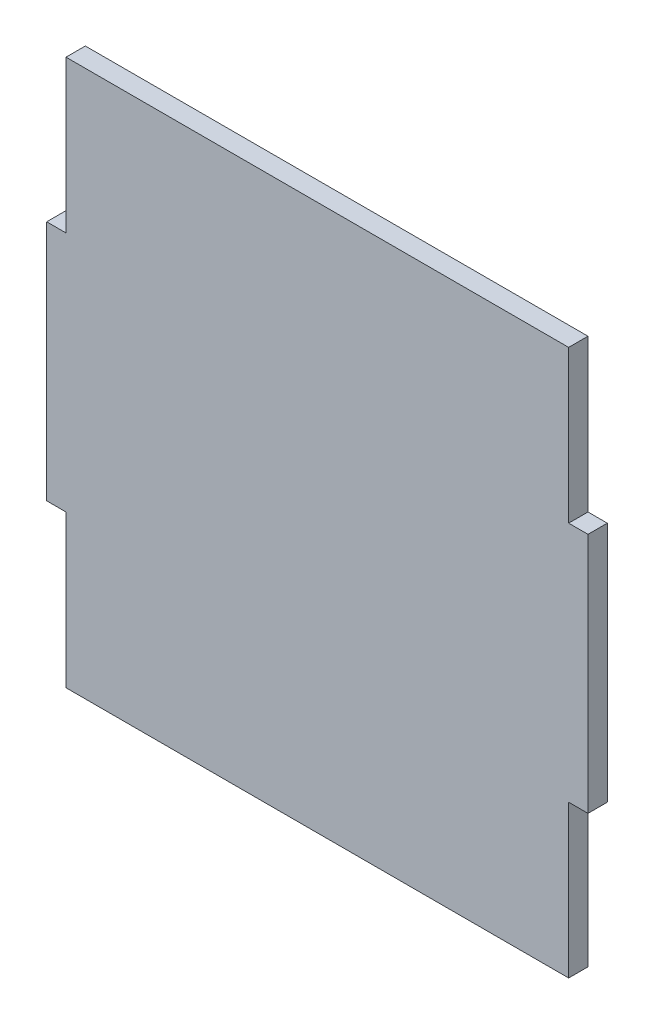
ISO-10303-21;
HEADER;
FILE_DESCRIPTION(('STEP AP214'),'2;1');
FILE_NAME('part.step','',(''),(''),'','','');
FILE_SCHEMA(('AUTOMOTIVE_DESIGN { 1 0 10303 214 1 1 1 1 }'));
ENDSEC;
DATA;
#1=APPLICATION_CONTEXT('core data for automotive mechanical design processes');
#2=APPLICATION_PROTOCOL_DEFINITION('international standard','automotive_design',2000,#1);
#3=PRODUCT_CONTEXT('',#1,'mechanical');
#4=PRODUCT('Part','Part','',(#3));
#5=PRODUCT_RELATED_PRODUCT_CATEGORY('part','',(#4));
#6=PRODUCT_DEFINITION_FORMATION('','',#4);
#7=PRODUCT_DEFINITION_CONTEXT('part definition',#1,'design');
#8=PRODUCT_DEFINITION('design','',#6,#7);
#9=PRODUCT_DEFINITION_SHAPE('','',#8);
#10=(LENGTH_UNIT() NAMED_UNIT(*) SI_UNIT(.MILLI.,.METRE.));
#11=(NAMED_UNIT(*) PLANE_ANGLE_UNIT() SI_UNIT($,.RADIAN.));
#12=(NAMED_UNIT(*) SI_UNIT($,.STERADIAN.) SOLID_ANGLE_UNIT());
#13=UNCERTAINTY_MEASURE_WITH_UNIT(LENGTH_MEASURE(1.E-05),#10,'distance_accuracy_value','');
#14=(GEOMETRIC_REPRESENTATION_CONTEXT(3) GLOBAL_UNCERTAINTY_ASSIGNED_CONTEXT((#13)) GLOBAL_UNIT_ASSIGNED_CONTEXT((#10,
#11,#12)) REPRESENTATION_CONTEXT('',''));
#15=CARTESIAN_POINT('',(0.,0.,0.));
#16=DIRECTION('',(0.,0.,1.));
#17=DIRECTION('',(1.,0.,0.));
#18=AXIS2_PLACEMENT_3D('',#15,#16,#17);
#19=CARTESIAN_POINT('',(-3.99999999999943,-80.,44.));
#20=DIRECTION('',(-1.,0.,0.));
#21=DIRECTION('',(0.,0.,1.));
#22=AXIS2_PLACEMENT_3D('',#19,#20,#21);
#23=PLANE('',#22);
#24=DIRECTION('',(0.,0.,-1.));
#25=VECTOR('',#24,1.);
#26=CARTESIAN_POINT('',(-3.99999999999943,-27.9999999999998,40.));
#27=LINE('',#26,#25);
#28=CARTESIAN_POINT('',(-3.99999999999943,-27.9999999999998,44.));
#29=VERTEX_POINT('',#28);
#30=CARTESIAN_POINT('',(-3.99999999999943,-27.9999999999998,40.));
#31=VERTEX_POINT('',#30);
#32=EDGE_CURVE('E52',#29,#31,#27,.T.);
#33=ORIENTED_EDGE('',*,*,#32,.F.);
#34=DIRECTION('',(0.,1.,0.));
#35=VECTOR('',#34,1.);
#36=CARTESIAN_POINT('',(-3.99999999999943,-80.,44.));
#37=LINE('',#36,#35);
#38=CARTESIAN_POINT('',(-3.99999999999943,-59.4999999999998,44.));
#39=VERTEX_POINT('',#38);
#40=EDGE_CURVE('E206',#39,#29,#37,.T.);
#41=ORIENTED_EDGE('',*,*,#40,.F.);
#42=DIRECTION('',(0.,0.,-1.));
#43=VECTOR('',#42,1.);
#44=CARTESIAN_POINT('',(-3.99999999999943,-59.4999999999998,44.));
#45=LINE('',#44,#43);
#46=CARTESIAN_POINT('',(-3.99999999999943,-59.4999999999998,40.));
#47=VERTEX_POINT('',#46);
#48=EDGE_CURVE('E199',#39,#47,#45,.T.);
#49=ORIENTED_EDGE('',*,*,#48,.T.);
#50=DIRECTION('',(0.,1.,0.));
#51=VECTOR('',#50,1.);
#52=CARTESIAN_POINT('',(-3.99999999999943,-80.,40.));
#53=LINE('',#52,#51);
#54=EDGE_CURVE('E208',#47,#31,#53,.T.);
#55=ORIENTED_EDGE('',*,*,#54,.T.);
#56=EDGE_LOOP('',(#33,#41,#49,#55));
#57=FACE_BOUND('',#56,.T.);
#58=ADVANCED_FACE('F36',(#57),#23,.F.);
#59=DIRECTION('',(0.,0.,1.));
#60=VECTOR('',#59,1.);
#61=CARTESIAN_POINT('',(-3.99999999999943,22.0000000000002,40.));
#62=LINE('',#61,#60);
#63=CARTESIAN_POINT('',(-3.99999999999943,22.0000000000002,40.));
#64=VERTEX_POINT('',#63);
#65=CARTESIAN_POINT('',(-3.99999999999943,22.0000000000002,44.));
#66=VERTEX_POINT('',#65);
#67=EDGE_CURVE('E60',#64,#66,#62,.T.);
#68=ORIENTED_EDGE('',*,*,#67,.F.);
#69=CARTESIAN_POINT('',(-3.99999999999943,53.5000000000002,40.));
#70=VERTEX_POINT('',#69);
#71=EDGE_CURVE('E150',#64,#70,#53,.T.);
#72=ORIENTED_EDGE('',*,*,#71,.T.);
#73=DIRECTION('',(0.,0.,-1.));
#74=VECTOR('',#73,1.);
#75=CARTESIAN_POINT('',(-3.99999999999943,53.5000000000002,44.));
#76=LINE('',#75,#74);
#77=CARTESIAN_POINT('',(-3.99999999999943,53.5000000000002,44.));
#78=VERTEX_POINT('',#77);
#79=EDGE_CURVE('E187',#78,#70,#76,.T.);
#80=ORIENTED_EDGE('',*,*,#79,.F.);
#81=EDGE_CURVE('E207',#66,#78,#37,.T.);
#82=ORIENTED_EDGE('',*,*,#81,.F.);
#83=EDGE_LOOP('',(#68,#72,#80,#82));
#84=FACE_BOUND('',#83,.T.);
#85=ADVANCED_FACE('F212',(#84),#23,.F.);
#86=CARTESIAN_POINT('',(-108.,-80.,44.));
#87=DIRECTION('',(1.,0.,0.));
#88=DIRECTION('',(0.,0.,-1.));
#89=AXIS2_PLACEMENT_3D('',#86,#87,#88);
#90=PLANE('',#89);
#91=DIRECTION('',(0.,0.,-1.));
#92=VECTOR('',#91,1.);
#93=CARTESIAN_POINT('',(-108.,22.0000000000002,40.));
#94=LINE('',#93,#92);
#95=CARTESIAN_POINT('',(-108.,22.0000000000002,44.));
#96=VERTEX_POINT('',#95);
#97=CARTESIAN_POINT('',(-108.,22.0000000000002,40.));
#98=VERTEX_POINT('',#97);
#99=EDGE_CURVE('E154',#96,#98,#94,.T.);
#100=ORIENTED_EDGE('',*,*,#99,.F.);
#101=DIRECTION('',(0.,-1.,0.));
#102=VECTOR('',#101,1.);
#103=CARTESIAN_POINT('',(-108.,-80.,44.));
#104=LINE('',#103,#102);
#105=CARTESIAN_POINT('',(-108.,53.5000000000002,44.));
#106=VERTEX_POINT('',#105);
#107=EDGE_CURVE('E11',#106,#96,#104,.T.);
#108=ORIENTED_EDGE('',*,*,#107,.F.);
#109=DIRECTION('',(0.,0.,-1.));
#110=VECTOR('',#109,1.);
#111=CARTESIAN_POINT('',(-108.,53.5000000000002,44.));
#112=LINE('',#111,#110);
#113=CARTESIAN_POINT('',(-108.,53.5000000000002,40.));
#114=VERTEX_POINT('',#113);
#115=EDGE_CURVE('E191',#106,#114,#112,.T.);
#116=ORIENTED_EDGE('',*,*,#115,.T.);
#117=DIRECTION('',(0.,-1.,0.));
#118=VECTOR('',#117,1.);
#119=CARTESIAN_POINT('',(-108.,-80.,40.));
#120=LINE('',#119,#118);
#121=EDGE_CURVE('E39',#114,#98,#120,.T.);
#122=ORIENTED_EDGE('',*,*,#121,.T.);
#123=EDGE_LOOP('',(#100,#108,#116,#122));
#124=FACE_BOUND('',#123,.T.);
#125=ADVANCED_FACE('F250',(#124),#90,.F.);
#126=DIRECTION('',(0.,0.,1.));
#127=VECTOR('',#126,1.);
#128=CARTESIAN_POINT('',(-108.,-27.9999999999998,40.));
#129=LINE('',#128,#127);
#130=CARTESIAN_POINT('',(-108.,-27.9999999999998,40.));
#131=VERTEX_POINT('',#130);
#132=CARTESIAN_POINT('',(-108.,-27.9999999999998,44.));
#133=VERTEX_POINT('',#132);
#134=EDGE_CURVE('E151',#131,#133,#129,.T.);
#135=ORIENTED_EDGE('',*,*,#134,.F.);
#136=CARTESIAN_POINT('',(-108.,-59.4999999999998,40.));
#137=VERTEX_POINT('',#136);
#138=EDGE_CURVE('E209',#131,#137,#120,.T.);
#139=ORIENTED_EDGE('',*,*,#138,.T.);
#140=DIRECTION('',(0.,0.,-1.));
#141=VECTOR('',#140,1.);
#142=CARTESIAN_POINT('',(-108.,-59.4999999999998,44.));
#143=LINE('',#142,#141);
#144=CARTESIAN_POINT('',(-108.,-59.4999999999998,44.));
#145=VERTEX_POINT('',#144);
#146=EDGE_CURVE('E190',#145,#137,#143,.T.);
#147=ORIENTED_EDGE('',*,*,#146,.F.);
#148=EDGE_CURVE('E44',#133,#145,#104,.T.);
#149=ORIENTED_EDGE('',*,*,#148,.F.);
#150=EDGE_LOOP('',(#135,#139,#147,#149));
#151=FACE_BOUND('',#150,.T.);
#152=ADVANCED_FACE('F239',(#151),#90,.F.);
#153=CARTESIAN_POINT('',(0.,0.,44.));
#154=DIRECTION('',(0.,0.,1.));
#155=DIRECTION('',(1.,0.,0.));
#156=AXIS2_PLACEMENT_3D('',#153,#154,#155);
#157=PLANE('',#156);
#158=DIRECTION('',(-1.,0.,0.));
#159=VECTOR('',#158,1.);
#160=CARTESIAN_POINT('',(0.,53.5000000000002,44.));
#161=LINE('',#160,#159);
#162=EDGE_CURVE('E184',#78,#106,#161,.T.);
#163=ORIENTED_EDGE('',*,*,#162,.T.);
#164=ORIENTED_EDGE('',*,*,#107,.T.);
#165=DIRECTION('',(1.,0.,0.));
#166=VECTOR('',#165,1.);
#167=CARTESIAN_POINT('',(-112.,22.0000000000002,44.));
#168=LINE('',#167,#166);
#169=CARTESIAN_POINT('',(-112.,22.0000000000002,44.));
#170=VERTEX_POINT('',#169);
#171=EDGE_CURVE('E174',#170,#96,#168,.T.);
#172=ORIENTED_EDGE('',*,*,#171,.F.);
#173=DIRECTION('',(0.,1.,0.));
#174=VECTOR('',#173,1.);
#175=CARTESIAN_POINT('',(-112.,-27.9999999999998,44.));
#176=LINE('',#175,#174);
#177=CARTESIAN_POINT('',(-112.,-27.9999999999998,44.));
#178=VERTEX_POINT('',#177);
#179=EDGE_CURVE('E165',#178,#170,#176,.T.);
#180=ORIENTED_EDGE('',*,*,#179,.F.);
#181=DIRECTION('',(1.,0.,0.));
#182=VECTOR('',#181,1.);
#183=CARTESIAN_POINT('',(-112.,-27.9999999999998,44.));
#184=LINE('',#183,#182);
#185=EDGE_CURVE('E177',#178,#133,#184,.T.);
#186=ORIENTED_EDGE('',*,*,#185,.T.);
#187=ORIENTED_EDGE('',*,*,#148,.T.);
#188=DIRECTION('',(-1.,0.,0.));
#189=VECTOR('',#188,1.);
#190=CARTESIAN_POINT('',(0.,-59.4999999999998,44.));
#191=LINE('',#190,#189);
#192=EDGE_CURVE('E196',#39,#145,#191,.T.);
#193=ORIENTED_EDGE('',*,*,#192,.F.);
#194=ORIENTED_EDGE('',*,*,#40,.T.);
#195=DIRECTION('',(-1.,0.,0.));
#196=VECTOR('',#195,1.);
#197=CARTESIAN_POINT('',(5.72458747072346E-13,-27.9999999999998,44.));
#198=LINE('',#197,#196);
#199=CARTESIAN_POINT('',(5.72458747072346E-13,-27.9999999999998,44.));
#200=VERTEX_POINT('',#199);
#201=EDGE_CURVE('E156',#200,#29,#198,.T.);
#202=ORIENTED_EDGE('',*,*,#201,.F.);
#203=DIRECTION('',(0.,-1.,0.));
#204=VECTOR('',#203,1.);
#205=CARTESIAN_POINT('',(5.72458747072346E-13,22.0000000000002,44.));
#206=LINE('',#205,#204);
#207=CARTESIAN_POINT('',(5.72458747072346E-13,22.0000000000002,44.));
#208=VERTEX_POINT('',#207);
#209=EDGE_CURVE('E136',#208,#200,#206,.T.);
#210=ORIENTED_EDGE('',*,*,#209,.F.);
#211=DIRECTION('',(-1.,0.,0.));
#212=VECTOR('',#211,1.);
#213=CARTESIAN_POINT('',(5.72458747072346E-13,22.0000000000002,44.));
#214=LINE('',#213,#212);
#215=EDGE_CURVE('E133',#208,#66,#214,.T.);
#216=ORIENTED_EDGE('',*,*,#215,.T.);
#217=ORIENTED_EDGE('',*,*,#81,.T.);
#218=EDGE_LOOP('',(#163,#164,#172,#180,#186,#187,#193,#194,#202,#210,#216,#217));
#219=FACE_BOUND('',#218,.T.);
#220=ADVANCED_FACE('F220',(#219),#157,.T.);
#221=CARTESIAN_POINT('',(0.,0.,40.));
#222=DIRECTION('',(0.,0.,1.));
#223=DIRECTION('',(1.,0.,0.));
#224=AXIS2_PLACEMENT_3D('',#221,#222,#223);
#225=PLANE('',#224);
#226=ORIENTED_EDGE('',*,*,#121,.F.);
#227=DIRECTION('',(-1.,0.,0.));
#228=VECTOR('',#227,1.);
#229=CARTESIAN_POINT('',(0.,53.5000000000002,40.));
#230=LINE('',#229,#228);
#231=EDGE_CURVE('E188',#70,#114,#230,.T.);
#232=ORIENTED_EDGE('',*,*,#231,.F.);
#233=ORIENTED_EDGE('',*,*,#71,.F.);
#234=DIRECTION('',(-1.,0.,0.));
#235=VECTOR('',#234,1.);
#236=CARTESIAN_POINT('',(5.72458747072346E-13,22.0000000000002,40.));
#237=LINE('',#236,#235);
#238=CARTESIAN_POINT('',(5.72458747072346E-13,22.0000000000002,40.));
#239=VERTEX_POINT('',#238);
#240=EDGE_CURVE('E131',#239,#64,#237,.T.);
#241=ORIENTED_EDGE('',*,*,#240,.F.);
#242=DIRECTION('',(0.,1.,0.));
#243=VECTOR('',#242,1.);
#244=CARTESIAN_POINT('',(5.72458747072346E-13,22.0000000000002,40.));
#245=LINE('',#244,#243);
#246=CARTESIAN_POINT('',(5.72458747072346E-13,-27.9999999999998,40.));
#247=VERTEX_POINT('',#246);
#248=EDGE_CURVE('E137',#247,#239,#245,.T.);
#249=ORIENTED_EDGE('',*,*,#248,.F.);
#250=DIRECTION('',(-1.,0.,0.));
#251=VECTOR('',#250,1.);
#252=CARTESIAN_POINT('',(5.72458747072346E-13,-27.9999999999998,40.));
#253=LINE('',#252,#251);
#254=EDGE_CURVE('E227',#247,#31,#253,.T.);
#255=ORIENTED_EDGE('',*,*,#254,.T.);
#256=ORIENTED_EDGE('',*,*,#54,.F.);
#257=DIRECTION('',(-1.,0.,0.));
#258=VECTOR('',#257,1.);
#259=CARTESIAN_POINT('',(0.,-59.4999999999998,40.));
#260=LINE('',#259,#258);
#261=EDGE_CURVE('E183',#47,#137,#260,.T.);
#262=ORIENTED_EDGE('',*,*,#261,.T.);
#263=ORIENTED_EDGE('',*,*,#138,.F.);
#264=DIRECTION('',(1.,0.,0.));
#265=VECTOR('',#264,1.);
#266=CARTESIAN_POINT('',(-112.,-27.9999999999998,40.));
#267=LINE('',#266,#265);
#268=CARTESIAN_POINT('',(-112.,-27.9999999999998,40.));
#269=VERTEX_POINT('',#268);
#270=EDGE_CURVE('E180',#269,#131,#267,.T.);
#271=ORIENTED_EDGE('',*,*,#270,.F.);
#272=DIRECTION('',(0.,-1.,0.));
#273=VECTOR('',#272,1.);
#274=CARTESIAN_POINT('',(-112.,-27.9999999999998,40.));
#275=LINE('',#274,#273);
#276=CARTESIAN_POINT('',(-112.,22.0000000000002,40.));
#277=VERTEX_POINT('',#276);
#278=EDGE_CURVE('E160',#277,#269,#275,.T.);
#279=ORIENTED_EDGE('',*,*,#278,.F.);
#280=DIRECTION('',(1.,0.,0.));
#281=VECTOR('',#280,1.);
#282=CARTESIAN_POINT('',(-112.,22.0000000000002,40.));
#283=LINE('',#282,#281);
#284=EDGE_CURVE('E168',#277,#98,#283,.T.);
#285=ORIENTED_EDGE('',*,*,#284,.T.);
#286=EDGE_LOOP('',(#226,#232,#233,#241,#249,#255,#256,#262,#263,#271,#279,#285));
#287=FACE_BOUND('',#286,.T.);
#288=ADVANCED_FACE('F148',(#287),#225,.F.);
#289=CARTESIAN_POINT('',(0.,-59.4999999999998,44.));
#290=DIRECTION('',(0.,-1.,0.));
#291=DIRECTION('',(0.,0.,-1.));
#292=AXIS2_PLACEMENT_3D('',#289,#290,#291);
#293=PLANE('',#292);
#294=ORIENTED_EDGE('',*,*,#261,.F.);
#295=ORIENTED_EDGE('',*,*,#48,.F.);
#296=ORIENTED_EDGE('',*,*,#192,.T.);
#297=ORIENTED_EDGE('',*,*,#146,.T.);
#298=EDGE_LOOP('',(#294,#295,#296,#297));
#299=FACE_BOUND('',#298,.T.);
#300=ADVANCED_FACE('F236',(#299),#293,.T.);
#301=CARTESIAN_POINT('',(0.,53.5000000000002,44.));
#302=DIRECTION('',(0.,-1.,0.));
#303=DIRECTION('',(0.,0.,-1.));
#304=AXIS2_PLACEMENT_3D('',#301,#302,#303);
#305=PLANE('',#304);
#306=ORIENTED_EDGE('',*,*,#231,.T.);
#307=ORIENTED_EDGE('',*,*,#115,.F.);
#308=ORIENTED_EDGE('',*,*,#162,.F.);
#309=ORIENTED_EDGE('',*,*,#79,.T.);
#310=EDGE_LOOP('',(#306,#307,#308,#309));
#311=FACE_BOUND('',#310,.T.);
#312=ADVANCED_FACE('F215',(#311),#305,.F.);
#313=CARTESIAN_POINT('',(-112.,-27.9999999999998,40.));
#314=DIRECTION('',(0.,1.,0.));
#315=DIRECTION('',(0.,0.,1.));
#316=AXIS2_PLACEMENT_3D('',#313,#314,#315);
#317=PLANE('',#316);
#318=ORIENTED_EDGE('',*,*,#134,.T.);
#319=ORIENTED_EDGE('',*,*,#185,.F.);
#320=DIRECTION('',(0.,0.,1.));
#321=VECTOR('',#320,1.);
#322=CARTESIAN_POINT('',(-112.,-27.9999999999998,40.));
#323=LINE('',#322,#321);
#324=EDGE_CURVE('E163',#269,#178,#323,.T.);
#325=ORIENTED_EDGE('',*,*,#324,.F.);
#326=ORIENTED_EDGE('',*,*,#270,.T.);
#327=EDGE_LOOP('',(#318,#319,#325,#326));
#328=FACE_BOUND('',#327,.T.);
#329=ADVANCED_FACE('F242',(#328),#317,.F.);
#330=CARTESIAN_POINT('',(-112.,22.0000000000002,40.));
#331=DIRECTION('',(0.,-1.,0.));
#332=DIRECTION('',(0.,0.,-1.));
#333=AXIS2_PLACEMENT_3D('',#330,#331,#332);
#334=PLANE('',#333);
#335=ORIENTED_EDGE('',*,*,#99,.T.);
#336=ORIENTED_EDGE('',*,*,#284,.F.);
#337=DIRECTION('',(0.,0.,-1.));
#338=VECTOR('',#337,1.);
#339=CARTESIAN_POINT('',(-112.,22.0000000000002,40.));
#340=LINE('',#339,#338);
#341=EDGE_CURVE('E167',#170,#277,#340,.T.);
#342=ORIENTED_EDGE('',*,*,#341,.F.);
#343=ORIENTED_EDGE('',*,*,#171,.T.);
#344=EDGE_LOOP('',(#335,#336,#342,#343));
#345=FACE_BOUND('',#344,.T.);
#346=ADVANCED_FACE('F249',(#345),#334,.F.);
#347=CARTESIAN_POINT('',(-112.,0.,0.));
#348=DIRECTION('',(1.,0.,0.));
#349=DIRECTION('',(0.,0.,-1.));
#350=AXIS2_PLACEMENT_3D('',#347,#348,#349);
#351=PLANE('',#350);
#352=ORIENTED_EDGE('',*,*,#278,.T.);
#353=ORIENTED_EDGE('',*,*,#324,.T.);
#354=ORIENTED_EDGE('',*,*,#179,.T.);
#355=ORIENTED_EDGE('',*,*,#341,.T.);
#356=EDGE_LOOP('',(#352,#353,#354,#355));
#357=FACE_BOUND('',#356,.T.);
#358=ADVANCED_FACE('F247',(#357),#351,.F.);
#359=CARTESIAN_POINT('',(5.72458747072346E-13,22.0000000000002,40.));
#360=DIRECTION('',(0.,-1.,0.));
#361=DIRECTION('',(0.,0.,-1.));
#362=AXIS2_PLACEMENT_3D('',#359,#360,#361);
#363=PLANE('',#362);
#364=ORIENTED_EDGE('',*,*,#67,.T.);
#365=ORIENTED_EDGE('',*,*,#215,.F.);
#366=DIRECTION('',(0.,0.,1.));
#367=VECTOR('',#366,1.);
#368=CARTESIAN_POINT('',(5.72458747072346E-13,22.0000000000002,40.));
#369=LINE('',#368,#367);
#370=EDGE_CURVE('E127',#239,#208,#369,.T.);
#371=ORIENTED_EDGE('',*,*,#370,.F.);
#372=ORIENTED_EDGE('',*,*,#240,.T.);
#373=EDGE_LOOP('',(#364,#365,#371,#372));
#374=FACE_BOUND('',#373,.T.);
#375=ADVANCED_FACE('F129',(#374),#363,.F.);
#376=CARTESIAN_POINT('',(5.72458747072346E-13,-27.9999999999998,40.));
#377=DIRECTION('',(0.,1.,0.));
#378=DIRECTION('',(0.,0.,1.));
#379=AXIS2_PLACEMENT_3D('',#376,#377,#378);
#380=PLANE('',#379);
#381=ORIENTED_EDGE('',*,*,#32,.T.);
#382=ORIENTED_EDGE('',*,*,#254,.F.);
#383=DIRECTION('',(0.,0.,-1.));
#384=VECTOR('',#383,1.);
#385=CARTESIAN_POINT('',(5.72458747072346E-13,-27.9999999999998,40.));
#386=LINE('',#385,#384);
#387=EDGE_CURVE('E142',#200,#247,#386,.T.);
#388=ORIENTED_EDGE('',*,*,#387,.F.);
#389=ORIENTED_EDGE('',*,*,#201,.T.);
#390=EDGE_LOOP('',(#381,#382,#388,#389));
#391=FACE_BOUND('',#390,.T.);
#392=ADVANCED_FACE('F231',(#391),#380,.F.);
#393=CARTESIAN_POINT('',(5.72458747072346E-13,0.,0.));
#394=DIRECTION('',(-1.,0.,0.));
#395=DIRECTION('',(0.,0.,1.));
#396=AXIS2_PLACEMENT_3D('',#393,#394,#395);
#397=PLANE('',#396);
#398=ORIENTED_EDGE('',*,*,#248,.T.);
#399=ORIENTED_EDGE('',*,*,#370,.T.);
#400=ORIENTED_EDGE('',*,*,#209,.T.);
#401=ORIENTED_EDGE('',*,*,#387,.T.);
#402=EDGE_LOOP('',(#398,#399,#400,#401));
#403=FACE_BOUND('',#402,.T.);
#404=ADVANCED_FACE('F140',(#403),#397,.F.);
#405=CLOSED_SHELL('',(#58,#85,#125,#152,#220,#288,#300,#312,#329,#346,#358,#375,#392,#404));
#406=MANIFOLD_SOLID_BREP('B2',#405);
#407=ADVANCED_BREP_SHAPE_REPRESENTATION('',(#18,#406),#14);
#408=SHAPE_DEFINITION_REPRESENTATION(#9,#407);
ENDSEC;
END-ISO-10303-21;
